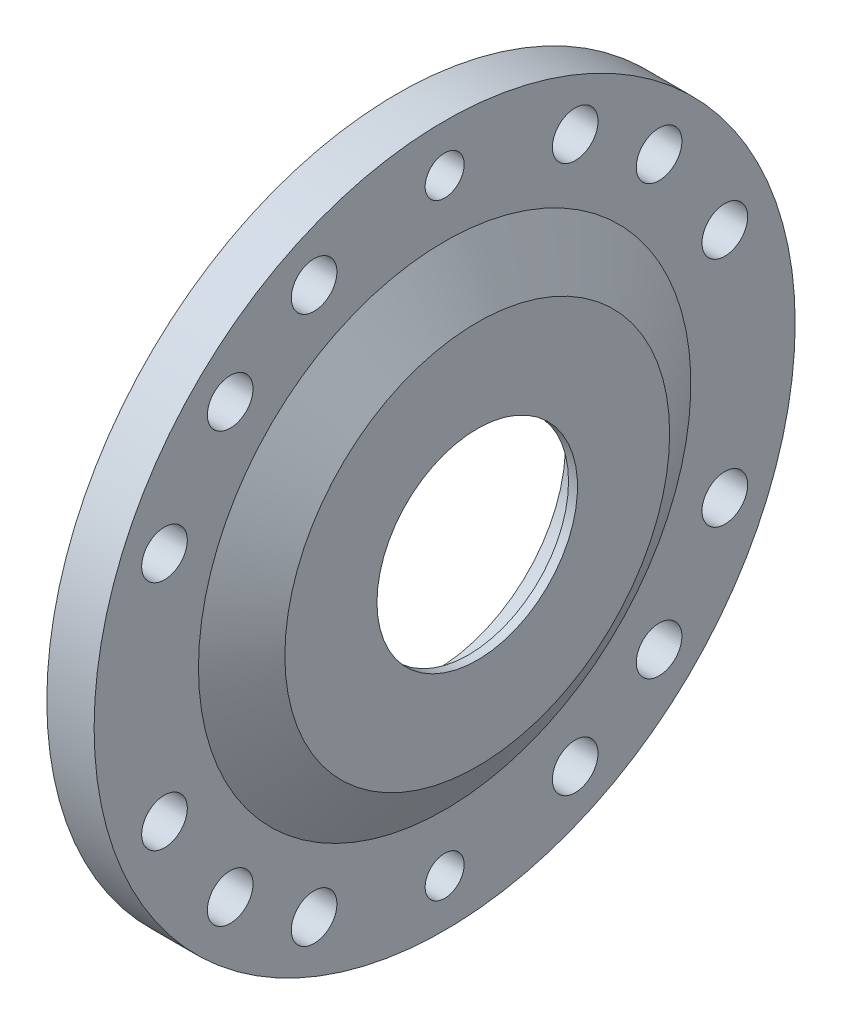
ISO-10303-21;
HEADER;
FILE_DESCRIPTION(('STEP AP214'),'2;1');
FILE_NAME('part.step','',(''),(''),'','','');
FILE_SCHEMA(('AUTOMOTIVE_DESIGN { 1 0 10303 214 1 1 1 1 }'));
ENDSEC;
DATA;
#1=APPLICATION_CONTEXT('core data for automotive mechanical design processes');
#2=APPLICATION_PROTOCOL_DEFINITION('international standard','automotive_design',2000,#1);
#3=PRODUCT_CONTEXT('',#1,'mechanical');
#4=PRODUCT('Part','Part','',(#3));
#5=PRODUCT_RELATED_PRODUCT_CATEGORY('part','',(#4));
#6=PRODUCT_DEFINITION_FORMATION('','',#4);
#7=PRODUCT_DEFINITION_CONTEXT('part definition',#1,'design');
#8=PRODUCT_DEFINITION('design','',#6,#7);
#9=PRODUCT_DEFINITION_SHAPE('','',#8);
#10=(LENGTH_UNIT() NAMED_UNIT(*) SI_UNIT(.MILLI.,.METRE.));
#11=(NAMED_UNIT(*) PLANE_ANGLE_UNIT() SI_UNIT($,.RADIAN.));
#12=(NAMED_UNIT(*) SI_UNIT($,.STERADIAN.) SOLID_ANGLE_UNIT());
#13=UNCERTAINTY_MEASURE_WITH_UNIT(LENGTH_MEASURE(1.E-05),#10,'distance_accuracy_value','');
#14=(GEOMETRIC_REPRESENTATION_CONTEXT(3) GLOBAL_UNCERTAINTY_ASSIGNED_CONTEXT((#13)) GLOBAL_UNIT_ASSIGNED_CONTEXT((#10,
#11,#12)) REPRESENTATION_CONTEXT('',''));
#15=CARTESIAN_POINT('',(0.,0.,0.));
#16=DIRECTION('',(0.,0.,1.));
#17=DIRECTION('',(1.,0.,0.));
#18=AXIS2_PLACEMENT_3D('',#15,#16,#17);
#19=CARTESIAN_POINT('',(78.2927896249337,0.,0.));
#20=DIRECTION('',(-1.,0.,0.));
#21=DIRECTION('',(0.,0.,1.));
#22=AXIS2_PLACEMENT_3D('',#19,#20,#21);
#23=PLANE('',#22);
#24=CARTESIAN_POINT('',(78.2927896249337,83.940431444537,-40.0375320031715));
#25=DIRECTION('',(-1.,0.,0.));
#26=DIRECTION('',(0.,0.,1.));
#27=AXIS2_PLACEMENT_3D('',#24,#25,#26);
#28=CIRCLE('',#27,7.);
#29=CARTESIAN_POINT('',(78.2927896249337,83.940431444537,-33.0375320031715));
#30=VERTEX_POINT('',#29);
#31=EDGE_CURVE('E103',#30,#30,#28,.T.);
#32=ORIENTED_EDGE('',*,*,#31,.T.);
#33=EDGE_LOOP('',(#32));
#34=FACE_BOUND('',#33,.T.);
#35=CARTESIAN_POINT('',(78.2927896249337,93.,0.));
#36=DIRECTION('',(-1.,0.,0.));
#37=DIRECTION('',(0.,0.,1.));
#38=AXIS2_PLACEMENT_3D('',#35,#36,#37);
#39=CIRCLE('',#38,5.983);
#40=CARTESIAN_POINT('',(78.2927896249337,93.,5.983));
#41=VERTEX_POINT('',#40);
#42=EDGE_CURVE('E107',#41,#41,#39,.T.);
#43=ORIENTED_EDGE('',*,*,#42,.T.);
#44=EDGE_LOOP('',(#43));
#45=FACE_BOUND('',#44,.T.);
#46=CARTESIAN_POINT('',(78.2927896249337,-35.5895592099531,85.9207965235497));
#47=DIRECTION('',(-1.,0.,0.));
#48=DIRECTION('',(0.,0.,1.));
#49=AXIS2_PLACEMENT_3D('',#46,#47,#48);
#50=CIRCLE('',#49,7.);
#51=CARTESIAN_POINT('',(78.2927896249337,-35.5895592099531,92.9207965235497));
#52=VERTEX_POINT('',#51);
#53=EDGE_CURVE('E123',#52,#52,#50,.T.);
#54=ORIENTED_EDGE('',*,*,#53,.T.);
#55=EDGE_LOOP('',(#54));
#56=FACE_BOUND('',#55,.T.);
#57=CARTESIAN_POINT('',(78.2927896249337,-65.7609306503488,65.760930650349));
#58=DIRECTION('',(-1.,0.,0.));
#59=DIRECTION('',(0.,0.,1.));
#60=AXIS2_PLACEMENT_3D('',#57,#58,#59);
#61=CIRCLE('',#60,7.00000000000004);
#62=CARTESIAN_POINT('',(78.2927896249337,-65.7609306503488,72.760930650349));
#63=VERTEX_POINT('',#62);
#64=EDGE_CURVE('E127',#63,#63,#61,.T.);
#65=ORIENTED_EDGE('',*,*,#64,.T.);
#66=EDGE_LOOP('',(#65));
#67=FACE_BOUND('',#66,.T.);
#68=CARTESIAN_POINT('',(78.2927896249337,-83.940431444537,40.0375320031714));
#69=DIRECTION('',(-1.,0.,0.));
#70=DIRECTION('',(0.,0.,1.));
#71=AXIS2_PLACEMENT_3D('',#68,#69,#70);
#72=CIRCLE('',#71,7.);
#73=CARTESIAN_POINT('',(78.2927896249337,-83.940431444537,47.0375320031714));
#74=VERTEX_POINT('',#73);
#75=EDGE_CURVE('E131',#74,#74,#72,.T.);
#76=ORIENTED_EDGE('',*,*,#75,.T.);
#77=EDGE_LOOP('',(#76));
#78=FACE_BOUND('',#77,.T.);
#79=CARTESIAN_POINT('',(78.2927896249337,35.589559209953,-85.9207965235498));
#80=DIRECTION('',(-1.,0.,0.));
#81=DIRECTION('',(0.,0.,1.));
#82=AXIS2_PLACEMENT_3D('',#79,#80,#81);
#83=CIRCLE('',#82,7.);
#84=CARTESIAN_POINT('',(78.2927896249337,35.589559209953,-78.9207965235498));
#85=VERTEX_POINT('',#84);
#86=EDGE_CURVE('E151',#85,#85,#83,.T.);
#87=ORIENTED_EDGE('',*,*,#86,.T.);
#88=EDGE_LOOP('',(#87));
#89=FACE_BOUND('',#88,.T.);
#90=CARTESIAN_POINT('',(78.2927896249337,65.7609306503488,-65.7609306503491));
#91=DIRECTION('',(-1.,0.,0.));
#92=DIRECTION('',(0.,0.,1.));
#93=AXIS2_PLACEMENT_3D('',#90,#91,#92);
#94=CIRCLE('',#93,7.);
#95=CARTESIAN_POINT('',(78.2927896249337,65.7609306503488,-58.760930650349));
#96=VERTEX_POINT('',#95);
#97=EDGE_CURVE('E155',#96,#96,#94,.T.);
#98=ORIENTED_EDGE('',*,*,#97,.T.);
#99=EDGE_LOOP('',(#98));
#100=FACE_BOUND('',#99,.T.);
#101=CARTESIAN_POINT('',(78.2927896249337,0.,0.));
#102=DIRECTION('',(-1.,0.,0.));
#103=DIRECTION('',(0.,0.,1.));
#104=AXIS2_PLACEMENT_3D('',#101,#102,#103);
#105=CIRCLE('',#104,107.5);
#106=CARTESIAN_POINT('',(78.2927896249337,0.,107.5));
#107=VERTEX_POINT('',#106);
#108=EDGE_CURVE('E79',#107,#107,#105,.T.);
#109=ORIENTED_EDGE('',*,*,#108,.F.);
#110=EDGE_LOOP('',(#109));
#111=FACE_BOUND('',#110,.T.);
#112=CARTESIAN_POINT('',(78.2927896249337,0.,0.));
#113=DIRECTION('',(-1.,0.,0.));
#114=DIRECTION('',(0.,0.,1.));
#115=AXIS2_PLACEMENT_3D('',#112,#113,#114);
#116=CIRCLE('',#115,75.5);
#117=CARTESIAN_POINT('',(78.2927896249337,0.,75.5));
#118=VERTEX_POINT('',#117);
#119=EDGE_CURVE('E75',#118,#118,#116,.T.);
#120=ORIENTED_EDGE('',*,*,#119,.T.);
#121=EDGE_LOOP('',(#120));
#122=FACE_BOUND('',#121,.T.);
#123=CARTESIAN_POINT('',(78.2927896249337,-35.589559209953,-85.9207965235498));
#124=DIRECTION('',(-1.,0.,0.));
#125=DIRECTION('',(0.,0.,1.));
#126=AXIS2_PLACEMENT_3D('',#123,#124,#125);
#127=CIRCLE('',#126,7.);
#128=CARTESIAN_POINT('',(78.2927896249337,-35.589559209953,-78.9207965235498));
#129=VERTEX_POINT('',#128);
#130=EDGE_CURVE('E147',#129,#129,#127,.F.);
#131=ORIENTED_EDGE('',*,*,#130,.F.);
#132=EDGE_LOOP('',(#131));
#133=FACE_BOUND('',#132,.T.);
#134=CARTESIAN_POINT('',(78.2927896249337,-65.7609306503488,-65.7609306503491));
#135=DIRECTION('',(-1.,0.,0.));
#136=DIRECTION('',(0.,0.,1.));
#137=AXIS2_PLACEMENT_3D('',#134,#135,#136);
#138=CIRCLE('',#137,7.00000000000002);
#139=CARTESIAN_POINT('',(78.2927896249337,-65.7609306503488,-58.7609306503491));
#140=VERTEX_POINT('',#139);
#141=EDGE_CURVE('E143',#140,#140,#138,.F.);
#142=ORIENTED_EDGE('',*,*,#141,.F.);
#143=EDGE_LOOP('',(#142));
#144=FACE_BOUND('',#143,.T.);
#145=CARTESIAN_POINT('',(78.2927896249337,-83.940431444537,-40.0375320031716));
#146=DIRECTION('',(-1.,0.,0.));
#147=DIRECTION('',(0.,0.,1.));
#148=AXIS2_PLACEMENT_3D('',#145,#146,#147);
#149=CIRCLE('',#148,7.);
#150=CARTESIAN_POINT('',(78.2927896249337,-83.940431444537,-33.0375320031716));
#151=VERTEX_POINT('',#150);
#152=EDGE_CURVE('E139',#151,#151,#149,.F.);
#153=ORIENTED_EDGE('',*,*,#152,.F.);
#154=EDGE_LOOP('',(#153));
#155=FACE_BOUND('',#154,.T.);
#156=CARTESIAN_POINT('',(78.2927896249337,-93.,0.));
#157=DIRECTION('',(-1.,0.,0.));
#158=DIRECTION('',(0.,0.,1.));
#159=AXIS2_PLACEMENT_3D('',#156,#157,#158);
#160=CIRCLE('',#159,5.98299999999995);
#161=CARTESIAN_POINT('',(78.2927896249337,-93.,5.98299999999995));
#162=VERTEX_POINT('',#161);
#163=EDGE_CURVE('E135',#162,#162,#160,.F.);
#164=ORIENTED_EDGE('',*,*,#163,.F.);
#165=EDGE_LOOP('',(#164));
#166=FACE_BOUND('',#165,.T.);
#167=CARTESIAN_POINT('',(78.2927896249337,35.5895592099531,85.9207965235498));
#168=DIRECTION('',(-1.,0.,0.));
#169=DIRECTION('',(0.,0.,1.));
#170=AXIS2_PLACEMENT_3D('',#167,#168,#169);
#171=CIRCLE('',#170,7.);
#172=CARTESIAN_POINT('',(78.2927896249337,35.5895592099531,92.9207965235498));
#173=VERTEX_POINT('',#172);
#174=EDGE_CURVE('E119',#173,#173,#171,.F.);
#175=ORIENTED_EDGE('',*,*,#174,.F.);
#176=EDGE_LOOP('',(#175));
#177=FACE_BOUND('',#176,.T.);
#178=CARTESIAN_POINT('',(78.2927896249337,65.7609306503488,65.7609306503491));
#179=DIRECTION('',(-1.,0.,0.));
#180=DIRECTION('',(0.,0.,1.));
#181=AXIS2_PLACEMENT_3D('',#178,#179,#180);
#182=CIRCLE('',#181,7.00000000000004);
#183=CARTESIAN_POINT('',(78.2927896249337,65.7609306503488,72.7609306503491));
#184=VERTEX_POINT('',#183);
#185=EDGE_CURVE('E115',#184,#184,#182,.F.);
#186=ORIENTED_EDGE('',*,*,#185,.F.);
#187=EDGE_LOOP('',(#186));
#188=FACE_BOUND('',#187,.T.);
#189=CARTESIAN_POINT('',(78.2927896249337,83.940431444537,40.0375320031715));
#190=DIRECTION('',(-1.,0.,0.));
#191=DIRECTION('',(0.,0.,1.));
#192=AXIS2_PLACEMENT_3D('',#189,#190,#191);
#193=CIRCLE('',#192,7.);
#194=CARTESIAN_POINT('',(78.2927896249337,83.940431444537,47.0375320031715));
#195=VERTEX_POINT('',#194);
#196=EDGE_CURVE('E111',#195,#195,#193,.F.);
#197=ORIENTED_EDGE('',*,*,#196,.F.);
#198=EDGE_LOOP('',(#197));
#199=FACE_BOUND('',#198,.T.);
#200=ADVANCED_FACE('F43',(#34,#45,#56,#67,#78,#89,#100,#111,#122,#133,#144,#155,#166,#177,#188,
#199),#23,.F.);
#201=CARTESIAN_POINT('',(63.7927896249337,0.,0.));
#202=DIRECTION('',(1.,0.,0.));
#203=DIRECTION('',(0.,0.,-1.));
#204=AXIS2_PLACEMENT_3D('',#201,#202,#203);
#205=PLANE('',#204);
#206=CARTESIAN_POINT('',(63.7927896249337,83.940431444537,-40.0375320031715));
#207=DIRECTION('',(-1.,0.,0.));
#208=DIRECTION('',(0.,0.,1.));
#209=AXIS2_PLACEMENT_3D('',#206,#207,#208);
#210=CIRCLE('',#209,7.);
#211=CARTESIAN_POINT('',(63.7927896249337,83.940431444537,-33.0375320031715));
#212=VERTEX_POINT('',#211);
#213=EDGE_CURVE('E163',#212,#212,#210,.T.);
#214=ORIENTED_EDGE('',*,*,#213,.F.);
#215=EDGE_LOOP('',(#214));
#216=FACE_BOUND('',#215,.T.);
#217=CARTESIAN_POINT('',(63.7927896249337,93.,0.));
#218=DIRECTION('',(-1.,0.,0.));
#219=DIRECTION('',(0.,0.,1.));
#220=AXIS2_PLACEMENT_3D('',#217,#218,#219);
#221=CIRCLE('',#220,5.983);
#222=CARTESIAN_POINT('',(63.7927896249337,93.,5.983));
#223=VERTEX_POINT('',#222);
#224=EDGE_CURVE('E189',#223,#223,#221,.T.);
#225=ORIENTED_EDGE('',*,*,#224,.F.);
#226=EDGE_LOOP('',(#225));
#227=FACE_BOUND('',#226,.T.);
#228=CARTESIAN_POINT('',(63.7927896249337,-35.5895592099531,85.9207965235497));
#229=DIRECTION('',(-1.,0.,0.));
#230=DIRECTION('',(0.,0.,1.));
#231=AXIS2_PLACEMENT_3D('',#228,#229,#230);
#232=CIRCLE('',#231,7.);
#233=CARTESIAN_POINT('',(63.7927896249337,-35.5895592099531,92.9207965235497));
#234=VERTEX_POINT('',#233);
#235=EDGE_CURVE('E173',#234,#234,#232,.T.);
#236=ORIENTED_EDGE('',*,*,#235,.F.);
#237=EDGE_LOOP('',(#236));
#238=FACE_BOUND('',#237,.T.);
#239=CARTESIAN_POINT('',(63.7927896249337,-65.7609306503488,65.760930650349));
#240=DIRECTION('',(-1.,0.,0.));
#241=DIRECTION('',(0.,0.,1.));
#242=AXIS2_PLACEMENT_3D('',#239,#240,#241);
#243=CIRCLE('',#242,7.00000000000004);
#244=CARTESIAN_POINT('',(63.7927896249337,-65.7609306503488,72.760930650349));
#245=VERTEX_POINT('',#244);
#246=EDGE_CURVE('E168',#245,#245,#243,.T.);
#247=ORIENTED_EDGE('',*,*,#246,.F.);
#248=EDGE_LOOP('',(#247));
#249=FACE_BOUND('',#248,.T.);
#250=CARTESIAN_POINT('',(63.7927896249337,-83.940431444537,40.0375320031714));
#251=DIRECTION('',(-1.,0.,0.));
#252=DIRECTION('',(0.,0.,1.));
#253=AXIS2_PLACEMENT_3D('',#250,#251,#252);
#254=CIRCLE('',#253,7.);
#255=CARTESIAN_POINT('',(63.7927896249337,-83.940431444537,47.0375320031714));
#256=VERTEX_POINT('',#255);
#257=EDGE_CURVE('E164',#256,#256,#254,.T.);
#258=ORIENTED_EDGE('',*,*,#257,.F.);
#259=EDGE_LOOP('',(#258));
#260=FACE_BOUND('',#259,.T.);
#261=CARTESIAN_POINT('',(63.7927896249337,35.589559209953,-85.9207965235498));
#262=DIRECTION('',(-1.,0.,0.));
#263=DIRECTION('',(0.,0.,1.));
#264=AXIS2_PLACEMENT_3D('',#261,#262,#263);
#265=CIRCLE('',#264,7.);
#266=CARTESIAN_POINT('',(63.7927896249337,35.589559209953,-78.9207965235498));
#267=VERTEX_POINT('',#266);
#268=EDGE_CURVE('E196',#267,#267,#265,.T.);
#269=ORIENTED_EDGE('',*,*,#268,.F.);
#270=EDGE_LOOP('',(#269));
#271=FACE_BOUND('',#270,.T.);
#272=CARTESIAN_POINT('',(63.7927896249337,65.7609306503488,-65.7609306503491));
#273=DIRECTION('',(-1.,0.,0.));
#274=DIRECTION('',(0.,0.,1.));
#275=AXIS2_PLACEMENT_3D('',#272,#273,#274);
#276=CIRCLE('',#275,7.);
#277=CARTESIAN_POINT('',(63.7927896249337,65.7609306503488,-58.760930650349));
#278=VERTEX_POINT('',#277);
#279=EDGE_CURVE('E159',#278,#278,#276,.T.);
#280=ORIENTED_EDGE('',*,*,#279,.F.);
#281=EDGE_LOOP('',(#280));
#282=FACE_BOUND('',#281,.T.);
#283=CARTESIAN_POINT('',(63.7927896249337,0.,0.));
#284=DIRECTION('',(-1.,0.,0.));
#285=DIRECTION('',(0.,0.,1.));
#286=AXIS2_PLACEMENT_3D('',#283,#284,#285);
#287=CIRCLE('',#286,70.);
#288=CARTESIAN_POINT('',(63.7927896249337,0.,70.));
#289=VERTEX_POINT('',#288);
#290=EDGE_CURVE('E87',#289,#289,#287,.T.);
#291=ORIENTED_EDGE('',*,*,#290,.F.);
#292=EDGE_LOOP('',(#291));
#293=FACE_BOUND('',#292,.T.);
#294=CARTESIAN_POINT('',(63.7927896249337,0.,0.));
#295=DIRECTION('',(-1.,0.,0.));
#296=DIRECTION('',(0.,0.,1.));
#297=AXIS2_PLACEMENT_3D('',#294,#295,#296);
#298=CIRCLE('',#297,107.5);
#299=CARTESIAN_POINT('',(63.7927896249337,0.,107.5));
#300=VERTEX_POINT('',#299);
#301=EDGE_CURVE('E83',#300,#300,#298,.T.);
#302=ORIENTED_EDGE('',*,*,#301,.T.);
#303=EDGE_LOOP('',(#302));
#304=FACE_BOUND('',#303,.T.);
#305=CARTESIAN_POINT('',(63.7927896249337,-35.589559209953,-85.9207965235498));
#306=DIRECTION('',(1.,0.,0.));
#307=DIRECTION('',(0.,0.,-1.));
#308=AXIS2_PLACEMENT_3D('',#305,#306,#307);
#309=CIRCLE('',#308,7.);
#310=CARTESIAN_POINT('',(63.7927896249337,-35.589559209953,-92.9207965235498));
#311=VERTEX_POINT('',#310);
#312=EDGE_CURVE('E200',#311,#311,#309,.T.);
#313=ORIENTED_EDGE('',*,*,#312,.T.);
#314=EDGE_LOOP('',(#313));
#315=FACE_BOUND('',#314,.T.);
#316=CARTESIAN_POINT('',(63.7927896249337,-65.7609306503488,-65.7609306503491));
#317=DIRECTION('',(1.,0.,0.));
#318=DIRECTION('',(0.,0.,-1.));
#319=AXIS2_PLACEMENT_3D('',#316,#317,#318);
#320=CIRCLE('',#319,7.00000000000002);
#321=CARTESIAN_POINT('',(63.7927896249337,-65.7609306503488,-72.7609306503491));
#322=VERTEX_POINT('',#321);
#323=EDGE_CURVE('E205',#322,#322,#320,.T.);
#324=ORIENTED_EDGE('',*,*,#323,.T.);
#325=EDGE_LOOP('',(#324));
#326=FACE_BOUND('',#325,.T.);
#327=CARTESIAN_POINT('',(63.7927896249337,-83.940431444537,-40.0375320031716));
#328=DIRECTION('',(1.,0.,0.));
#329=DIRECTION('',(0.,0.,-1.));
#330=AXIS2_PLACEMENT_3D('',#327,#328,#329);
#331=CIRCLE('',#330,7.);
#332=CARTESIAN_POINT('',(63.7927896249337,-83.940431444537,-47.0375320031716));
#333=VERTEX_POINT('',#332);
#334=EDGE_CURVE('E209',#333,#333,#331,.T.);
#335=ORIENTED_EDGE('',*,*,#334,.T.);
#336=EDGE_LOOP('',(#335));
#337=FACE_BOUND('',#336,.T.);
#338=CARTESIAN_POINT('',(63.7927896249337,-93.,0.));
#339=DIRECTION('',(1.,0.,0.));
#340=DIRECTION('',(0.,0.,-1.));
#341=AXIS2_PLACEMENT_3D('',#338,#339,#340);
#342=CIRCLE('',#341,5.98299999999995);
#343=CARTESIAN_POINT('',(63.7927896249337,-93.,-5.98299999999995));
#344=VERTEX_POINT('',#343);
#345=EDGE_CURVE('E169',#344,#344,#342,.T.);
#346=ORIENTED_EDGE('',*,*,#345,.T.);
#347=EDGE_LOOP('',(#346));
#348=FACE_BOUND('',#347,.T.);
#349=CARTESIAN_POINT('',(63.7927896249337,35.5895592099531,85.9207965235498));
#350=DIRECTION('',(1.,0.,0.));
#351=DIRECTION('',(0.,0.,-1.));
#352=AXIS2_PLACEMENT_3D('',#349,#350,#351);
#353=CIRCLE('',#352,7.);
#354=CARTESIAN_POINT('',(63.7927896249337,35.5895592099531,78.9207965235498));
#355=VERTEX_POINT('',#354);
#356=EDGE_CURVE('E177',#355,#355,#353,.T.);
#357=ORIENTED_EDGE('',*,*,#356,.T.);
#358=EDGE_LOOP('',(#357));
#359=FACE_BOUND('',#358,.T.);
#360=CARTESIAN_POINT('',(63.7927896249337,65.7609306503488,65.7609306503491));
#361=DIRECTION('',(1.,0.,0.));
#362=DIRECTION('',(0.,0.,-1.));
#363=AXIS2_PLACEMENT_3D('',#360,#361,#362);
#364=CIRCLE('',#363,7.00000000000004);
#365=CARTESIAN_POINT('',(63.7927896249337,65.7609306503488,58.760930650349));
#366=VERTEX_POINT('',#365);
#367=EDGE_CURVE('E181',#366,#366,#364,.T.);
#368=ORIENTED_EDGE('',*,*,#367,.T.);
#369=EDGE_LOOP('',(#368));
#370=FACE_BOUND('',#369,.T.);
#371=CARTESIAN_POINT('',(63.7927896249337,83.940431444537,40.0375320031715));
#372=DIRECTION('',(1.,0.,0.));
#373=DIRECTION('',(0.,0.,-1.));
#374=AXIS2_PLACEMENT_3D('',#371,#372,#373);
#375=CIRCLE('',#374,7.);
#376=CARTESIAN_POINT('',(63.7927896249337,83.940431444537,33.0375320031715));
#377=VERTEX_POINT('',#376);
#378=EDGE_CURVE('E185',#377,#377,#375,.T.);
#379=ORIENTED_EDGE('',*,*,#378,.T.);
#380=EDGE_LOOP('',(#379));
#381=FACE_BOUND('',#380,.T.);
#382=ADVANCED_FACE('F244',(#216,#227,#238,#249,#260,#271,#282,#293,#304,#315,#326,#337,#348,
#359,#370,#381),#205,.F.);
#383=CARTESIAN_POINT('',(85.5363851305517,0.,0.));
#384=DIRECTION('',(-1.,0.,0.));
#385=DIRECTION('',(0.,0.,1.));
#386=AXIS2_PLACEMENT_3D('',#383,#384,#385);
#387=CYLINDRICAL_SURFACE('',#386,40.);
#388=CARTESIAN_POINT('',(85.5363851305517,0.,0.));
#389=DIRECTION('',(-1.,0.,0.));
#390=DIRECTION('',(0.,0.,1.));
#391=AXIS2_PLACEMENT_3D('',#388,#389,#390);
#392=CIRCLE('',#391,40.);
#393=CARTESIAN_POINT('',(85.5363851305517,0.,40.));
#394=VERTEX_POINT('',#393);
#395=EDGE_CURVE('E67',#394,#394,#392,.T.);
#396=ORIENTED_EDGE('',*,*,#395,.F.);
#397=EDGE_LOOP('',(#396));
#398=FACE_BOUND('',#397,.T.);
#399=CARTESIAN_POINT('',(75.3478458047089,0.,0.));
#400=DIRECTION('',(-1.,0.,0.));
#401=DIRECTION('',(0.,0.,1.));
#402=AXIS2_PLACEMENT_3D('',#399,#400,#401);
#403=CIRCLE('',#402,40.);
#404=CARTESIAN_POINT('',(75.3478458047089,0.,40.));
#405=VERTEX_POINT('',#404);
#406=EDGE_CURVE('E99',#405,#405,#403,.T.);
#407=ORIENTED_EDGE('',*,*,#406,.T.);
#408=EDGE_LOOP('',(#407));
#409=FACE_BOUND('',#408,.T.);
#410=ADVANCED_FACE('F238',(#398,#409),#387,.F.);
#411=CARTESIAN_POINT('',(85.5363851305517,0.,0.));
#412=DIRECTION('',(1.,0.,0.));
#413=DIRECTION('',(0.,0.,-1.));
#414=AXIS2_PLACEMENT_3D('',#411,#412,#413);
#415=PLANE('',#414);
#416=CARTESIAN_POINT('',(85.5363851305517,0.,0.));
#417=DIRECTION('',(1.,0.,0.));
#418=DIRECTION('',(0.,0.,-1.));
#419=AXIS2_PLACEMENT_3D('',#416,#417,#418);
#420=CIRCLE('',#419,30.75);
#421=CARTESIAN_POINT('',(85.5363851305517,0.,-30.75));
#422=VERTEX_POINT('',#421);
#423=EDGE_CURVE('E201',#422,#422,#420,.T.);
#424=ORIENTED_EDGE('',*,*,#423,.T.);
#425=EDGE_LOOP('',(#424));
#426=FACE_BOUND('',#425,.T.);
#427=ORIENTED_EDGE('',*,*,#395,.T.);
#428=EDGE_LOOP('',(#427));
#429=FACE_BOUND('',#428,.T.);
#430=ADVANCED_FACE('F235',(#426,#429),#415,.F.);
#431=CARTESIAN_POINT('',(88.2927896249337,0.,0.));
#432=DIRECTION('',(-1.,0.,0.));
#433=DIRECTION('',(0.,0.,1.));
#434=AXIS2_PLACEMENT_3D('',#431,#432,#433);
#435=PLANE('',#434);
#436=CARTESIAN_POINT('',(88.2927896249337,0.,0.));
#437=DIRECTION('',(-1.,0.,0.));
#438=DIRECTION('',(0.,0.,1.));
#439=AXIS2_PLACEMENT_3D('',#436,#437,#438);
#440=CIRCLE('',#439,30.75);
#441=CARTESIAN_POINT('',(88.2927896249337,0.,30.75));
#442=VERTEX_POINT('',#441);
#443=EDGE_CURVE('E219',#442,#442,#440,.T.);
#444=ORIENTED_EDGE('',*,*,#443,.T.);
#445=EDGE_LOOP('',(#444));
#446=FACE_BOUND('',#445,.T.);
#447=CARTESIAN_POINT('',(88.2927896249337,0.,0.));
#448=DIRECTION('',(-1.,0.,0.));
#449=DIRECTION('',(0.,0.,1.));
#450=AXIS2_PLACEMENT_3D('',#447,#448,#449);
#451=CIRCLE('',#450,59.);
#452=CARTESIAN_POINT('',(88.2927896249337,0.,59.));
#453=VERTEX_POINT('',#452);
#454=EDGE_CURVE('E71',#453,#453,#451,.T.);
#455=ORIENTED_EDGE('',*,*,#454,.F.);
#456=EDGE_LOOP('',(#455));
#457=FACE_BOUND('',#456,.T.);
#458=ADVANCED_FACE('F224',(#446,#457),#435,.F.);
#459=CARTESIAN_POINT('',(88.2927896249337,0.,0.));
#460=DIRECTION('',(-1.,0.,0.));
#461=DIRECTION('',(0.,0.,1.));
#462=AXIS2_PLACEMENT_3D('',#459,#460,#461);
#463=CONICAL_SURFACE('',#462,59.,1.02593241134335);
#464=ORIENTED_EDGE('',*,*,#119,.F.);
#465=EDGE_LOOP('',(#464));
#466=FACE_BOUND('',#465,.T.);
#467=ORIENTED_EDGE('',*,*,#454,.T.);
#468=EDGE_LOOP('',(#467));
#469=FACE_BOUND('',#468,.T.);
#470=ADVANCED_FACE('F274',(#466,#469),#463,.T.);
#471=CARTESIAN_POINT('',(85.5363851305517,0.,0.));
#472=DIRECTION('',(-1.,0.,0.));
#473=DIRECTION('',(0.,0.,1.));
#474=AXIS2_PLACEMENT_3D('',#471,#472,#473);
#475=CYLINDRICAL_SURFACE('',#474,107.5);
#476=ORIENTED_EDGE('',*,*,#301,.F.);
#477=EDGE_LOOP('',(#476));
#478=FACE_BOUND('',#477,.T.);
#479=ORIENTED_EDGE('',*,*,#108,.T.);
#480=EDGE_LOOP('',(#479));
#481=FACE_BOUND('',#480,.T.);
#482=ADVANCED_FACE('F273',(#478,#481),#475,.T.);
#483=CARTESIAN_POINT('',(85.5363851305517,0.,0.));
#484=DIRECTION('',(-1.,0.,0.));
#485=DIRECTION('',(0.,0.,1.));
#486=AXIS2_PLACEMENT_3D('',#483,#484,#485);
#487=CYLINDRICAL_SURFACE('',#486,70.);
#488=CARTESIAN_POINT('',(61.7927896249337,0.,0.));
#489=DIRECTION('',(1.,0.,0.));
#490=DIRECTION('',(0.,0.,-1.));
#491=AXIS2_PLACEMENT_3D('',#488,#489,#490);
#492=CIRCLE('',#491,70.);
#493=CARTESIAN_POINT('',(61.7927896249337,0.,-70.));
#494=VERTEX_POINT('',#493);
#495=EDGE_CURVE('E56',#494,#494,#492,.T.);
#496=ORIENTED_EDGE('',*,*,#495,.T.);
#497=EDGE_LOOP('',(#496));
#498=FACE_BOUND('',#497,.T.);
#499=ORIENTED_EDGE('',*,*,#290,.T.);
#500=EDGE_LOOP('',(#499));
#501=FACE_BOUND('',#500,.T.);
#502=ADVANCED_FACE('F292',(#498,#501),#487,.T.);
#503=CARTESIAN_POINT('',(60.7927896249337,0.,0.));
#504=DIRECTION('',(1.,0.,0.));
#505=DIRECTION('',(0.,0.,-1.));
#506=AXIS2_PLACEMENT_3D('',#503,#504,#505);
#507=PLANE('',#506);
#508=CARTESIAN_POINT('',(60.7927896249337,0.,0.));
#509=DIRECTION('',(1.,0.,0.));
#510=DIRECTION('',(0.,0.,-1.));
#511=AXIS2_PLACEMENT_3D('',#508,#509,#510);
#512=CIRCLE('',#511,69.);
#513=CARTESIAN_POINT('',(60.7927896249337,0.,-69.));
#514=VERTEX_POINT('',#513);
#515=EDGE_CURVE('E61',#514,#514,#512,.F.);
#516=ORIENTED_EDGE('',*,*,#515,.T.);
#517=EDGE_LOOP('',(#516));
#518=FACE_BOUND('',#517,.T.);
#519=CARTESIAN_POINT('',(60.7927896249337,0.,0.));
#520=DIRECTION('',(-1.,0.,0.));
#521=DIRECTION('',(0.,0.,1.));
#522=AXIS2_PLACEMENT_3D('',#519,#520,#521);
#523=CIRCLE('',#522,61.);
#524=CARTESIAN_POINT('',(60.7927896249337,0.,61.));
#525=VERTEX_POINT('',#524);
#526=EDGE_CURVE('E91',#525,#525,#523,.T.);
#527=ORIENTED_EDGE('',*,*,#526,.F.);
#528=EDGE_LOOP('',(#527));
#529=FACE_BOUND('',#528,.T.);
#530=ADVANCED_FACE('F289',(#518,#529),#507,.F.);
#531=CARTESIAN_POINT('',(60.7927896249337,0.,0.));
#532=DIRECTION('',(-1.,0.,0.));
#533=DIRECTION('',(0.,0.,1.));
#534=AXIS2_PLACEMENT_3D('',#531,#532,#533);
#535=CONICAL_SURFACE('',#534,61.,1.02593241134334);
#536=CARTESIAN_POINT('',(61.3988502309943,0.,0.));
#537=DIRECTION('',(-1.,0.,0.));
#538=DIRECTION('',(0.,0.,1.));
#539=AXIS2_PLACEMENT_3D('',#536,#537,#538);
#540=CIRCLE('',#539,60.);
#541=CARTESIAN_POINT('',(61.3988502309943,0.,60.));
#542=VERTEX_POINT('',#541);
#543=EDGE_CURVE('E95',#542,#542,#540,.T.);
#544=ORIENTED_EDGE('',*,*,#543,.F.);
#545=EDGE_LOOP('',(#544));
#546=FACE_BOUND('',#545,.T.);
#547=ORIENTED_EDGE('',*,*,#526,.T.);
#548=EDGE_LOOP('',(#547));
#549=FACE_BOUND('',#548,.T.);
#550=ADVANCED_FACE('F260',(#546,#549),#535,.F.);
#551=CARTESIAN_POINT('',(85.5363851305517,0.,0.));
#552=DIRECTION('',(-1.,0.,0.));
#553=DIRECTION('',(0.,0.,1.));
#554=AXIS2_PLACEMENT_3D('',#551,#552,#553);
#555=CYLINDRICAL_SURFACE('',#554,60.);
#556=CARTESIAN_POINT('',(72.8478458047089,0.,0.));
#557=DIRECTION('',(1.,0.,0.));
#558=DIRECTION('',(0.,0.,-1.));
#559=AXIS2_PLACEMENT_3D('',#556,#557,#558);
#560=CIRCLE('',#559,60.);
#561=CARTESIAN_POINT('',(72.8478458047089,0.,-60.));
#562=VERTEX_POINT('',#561);
#563=EDGE_CURVE('E10',#562,#562,#560,.T.);
#564=ORIENTED_EDGE('',*,*,#563,.T.);
#565=EDGE_LOOP('',(#564));
#566=FACE_BOUND('',#565,.T.);
#567=ORIENTED_EDGE('',*,*,#543,.T.);
#568=EDGE_LOOP('',(#567));
#569=FACE_BOUND('',#568,.T.);
#570=ADVANCED_FACE('F251',(#566,#569),#555,.F.);
#571=CARTESIAN_POINT('',(75.3478458047089,0.,0.));
#572=DIRECTION('',(1.,0.,0.));
#573=DIRECTION('',(0.,0.,-1.));
#574=AXIS2_PLACEMENT_3D('',#571,#572,#573);
#575=PLANE('',#574);
#576=CARTESIAN_POINT('',(75.3478458047089,0.,0.));
#577=DIRECTION('',(1.,0.,0.));
#578=DIRECTION('',(0.,0.,-1.));
#579=AXIS2_PLACEMENT_3D('',#576,#577,#578);
#580=CIRCLE('',#579,57.5);
#581=CARTESIAN_POINT('',(75.3478458047089,0.,-57.5));
#582=VERTEX_POINT('',#581);
#583=EDGE_CURVE('E51',#582,#582,#580,.F.);
#584=ORIENTED_EDGE('',*,*,#583,.T.);
#585=EDGE_LOOP('',(#584));
#586=FACE_BOUND('',#585,.T.);
#587=ORIENTED_EDGE('',*,*,#406,.F.);
#588=EDGE_LOOP('',(#587));
#589=FACE_BOUND('',#588,.T.);
#590=ADVANCED_FACE('F248',(#586,#589),#575,.F.);
#591=CARTESIAN_POINT('',(88.2927896249337,65.7609306503488,-65.7609306503491));
#592=DIRECTION('',(-1.,0.,0.));
#593=DIRECTION('',(0.,0.,1.));
#594=AXIS2_PLACEMENT_3D('',#591,#592,#593);
#595=CYLINDRICAL_SURFACE('',#594,7.);
#596=ORIENTED_EDGE('',*,*,#279,.T.);
#597=EDGE_LOOP('',(#596));
#598=FACE_BOUND('',#597,.T.);
#599=ORIENTED_EDGE('',*,*,#97,.F.);
#600=EDGE_LOOP('',(#599));
#601=FACE_BOUND('',#600,.T.);
#602=ADVANCED_FACE('F250',(#598,#601),#595,.F.);
#603=CARTESIAN_POINT('',(88.2927896249337,35.589559209953,-85.9207965235498));
#604=DIRECTION('',(-1.,0.,0.));
#605=DIRECTION('',(0.,0.,1.));
#606=AXIS2_PLACEMENT_3D('',#603,#604,#605);
#607=CYLINDRICAL_SURFACE('',#606,7.);
#608=ORIENTED_EDGE('',*,*,#268,.T.);
#609=EDGE_LOOP('',(#608));
#610=FACE_BOUND('',#609,.T.);
#611=ORIENTED_EDGE('',*,*,#86,.F.);
#612=EDGE_LOOP('',(#611));
#613=FACE_BOUND('',#612,.T.);
#614=ADVANCED_FACE('F257',(#610,#613),#607,.F.);
#615=CARTESIAN_POINT('',(88.2927896249337,-35.589559209953,-85.9207965235498));
#616=DIRECTION('',(-1.,0.,0.));
#617=DIRECTION('',(0.,0.,1.));
#618=AXIS2_PLACEMENT_3D('',#615,#616,#617);
#619=CYLINDRICAL_SURFACE('',#618,7.);
#620=ORIENTED_EDGE('',*,*,#312,.F.);
#621=EDGE_LOOP('',(#620));
#622=FACE_BOUND('',#621,.T.);
#623=ORIENTED_EDGE('',*,*,#130,.T.);
#624=EDGE_LOOP('',(#623));
#625=FACE_BOUND('',#624,.T.);
#626=ADVANCED_FACE('F404',(#622,#625),#619,.F.);
#627=CARTESIAN_POINT('',(88.2927896249337,-65.7609306503488,-65.7609306503491));
#628=DIRECTION('',(-1.,0.,0.));
#629=DIRECTION('',(0.,0.,1.));
#630=AXIS2_PLACEMENT_3D('',#627,#628,#629);
#631=CYLINDRICAL_SURFACE('',#630,7.00000000000002);
#632=ORIENTED_EDGE('',*,*,#323,.F.);
#633=EDGE_LOOP('',(#632));
#634=FACE_BOUND('',#633,.T.);
#635=ORIENTED_EDGE('',*,*,#141,.T.);
#636=EDGE_LOOP('',(#635));
#637=FACE_BOUND('',#636,.T.);
#638=ADVANCED_FACE('F398',(#634,#637),#631,.F.);
#639=CARTESIAN_POINT('',(88.2927896249337,-83.940431444537,-40.0375320031716));
#640=DIRECTION('',(-1.,0.,0.));
#641=DIRECTION('',(0.,0.,1.));
#642=AXIS2_PLACEMENT_3D('',#639,#640,#641);
#643=CYLINDRICAL_SURFACE('',#642,7.);
#644=ORIENTED_EDGE('',*,*,#334,.F.);
#645=EDGE_LOOP('',(#644));
#646=FACE_BOUND('',#645,.T.);
#647=ORIENTED_EDGE('',*,*,#152,.T.);
#648=EDGE_LOOP('',(#647));
#649=FACE_BOUND('',#648,.T.);
#650=ADVANCED_FACE('F366',(#646,#649),#643,.F.);
#651=CARTESIAN_POINT('',(88.2927896249337,-93.,0.));
#652=DIRECTION('',(-1.,0.,0.));
#653=DIRECTION('',(0.,0.,1.));
#654=AXIS2_PLACEMENT_3D('',#651,#652,#653);
#655=CYLINDRICAL_SURFACE('',#654,5.98299999999995);
#656=ORIENTED_EDGE('',*,*,#345,.F.);
#657=EDGE_LOOP('',(#656));
#658=FACE_BOUND('',#657,.T.);
#659=ORIENTED_EDGE('',*,*,#163,.T.);
#660=EDGE_LOOP('',(#659));
#661=FACE_BOUND('',#660,.T.);
#662=ADVANCED_FACE('F361',(#658,#661),#655,.F.);
#663=CARTESIAN_POINT('',(88.2927896249337,-83.940431444537,40.0375320031714));
#664=DIRECTION('',(-1.,0.,0.));
#665=DIRECTION('',(0.,0.,1.));
#666=AXIS2_PLACEMENT_3D('',#663,#664,#665);
#667=CYLINDRICAL_SURFACE('',#666,7.);
#668=ORIENTED_EDGE('',*,*,#257,.T.);
#669=EDGE_LOOP('',(#668));
#670=FACE_BOUND('',#669,.T.);
#671=ORIENTED_EDGE('',*,*,#75,.F.);
#672=EDGE_LOOP('',(#671));
#673=FACE_BOUND('',#672,.T.);
#674=ADVANCED_FACE('F358',(#670,#673),#667,.F.);
#675=CARTESIAN_POINT('',(88.2927896249337,-65.7609306503488,65.760930650349));
#676=DIRECTION('',(-1.,0.,0.));
#677=DIRECTION('',(0.,0.,1.));
#678=AXIS2_PLACEMENT_3D('',#675,#676,#677);
#679=CYLINDRICAL_SURFACE('',#678,7.00000000000004);
#680=ORIENTED_EDGE('',*,*,#246,.T.);
#681=EDGE_LOOP('',(#680));
#682=FACE_BOUND('',#681,.T.);
#683=ORIENTED_EDGE('',*,*,#64,.F.);
#684=EDGE_LOOP('',(#683));
#685=FACE_BOUND('',#684,.T.);
#686=ADVANCED_FACE('F354',(#682,#685),#679,.F.);
#687=CARTESIAN_POINT('',(88.2927896249337,-35.5895592099531,85.9207965235497));
#688=DIRECTION('',(-1.,0.,0.));
#689=DIRECTION('',(0.,0.,1.));
#690=AXIS2_PLACEMENT_3D('',#687,#688,#689);
#691=CYLINDRICAL_SURFACE('',#690,7.);
#692=ORIENTED_EDGE('',*,*,#235,.T.);
#693=EDGE_LOOP('',(#692));
#694=FACE_BOUND('',#693,.T.);
#695=ORIENTED_EDGE('',*,*,#53,.F.);
#696=EDGE_LOOP('',(#695));
#697=FACE_BOUND('',#696,.T.);
#698=ADVANCED_FACE('F350',(#694,#697),#691,.F.);
#699=CARTESIAN_POINT('',(88.2927896249337,35.5895592099531,85.9207965235498));
#700=DIRECTION('',(-1.,0.,0.));
#701=DIRECTION('',(0.,0.,1.));
#702=AXIS2_PLACEMENT_3D('',#699,#700,#701);
#703=CYLINDRICAL_SURFACE('',#702,7.);
#704=ORIENTED_EDGE('',*,*,#356,.F.);
#705=EDGE_LOOP('',(#704));
#706=FACE_BOUND('',#705,.T.);
#707=ORIENTED_EDGE('',*,*,#174,.T.);
#708=EDGE_LOOP('',(#707));
#709=FACE_BOUND('',#708,.T.);
#710=ADVANCED_FACE('F343',(#706,#709),#703,.F.);
#711=CARTESIAN_POINT('',(88.2927896249337,65.7609306503488,65.7609306503491));
#712=DIRECTION('',(-1.,0.,0.));
#713=DIRECTION('',(0.,0.,1.));
#714=AXIS2_PLACEMENT_3D('',#711,#712,#713);
#715=CYLINDRICAL_SURFACE('',#714,7.00000000000004);
#716=ORIENTED_EDGE('',*,*,#367,.F.);
#717=EDGE_LOOP('',(#716));
#718=FACE_BOUND('',#717,.T.);
#719=ORIENTED_EDGE('',*,*,#185,.T.);
#720=EDGE_LOOP('',(#719));
#721=FACE_BOUND('',#720,.T.);
#722=ADVANCED_FACE('F333',(#718,#721),#715,.F.);
#723=CARTESIAN_POINT('',(88.2927896249337,83.940431444537,40.0375320031715));
#724=DIRECTION('',(-1.,0.,0.));
#725=DIRECTION('',(0.,0.,1.));
#726=AXIS2_PLACEMENT_3D('',#723,#724,#725);
#727=CYLINDRICAL_SURFACE('',#726,7.);
#728=ORIENTED_EDGE('',*,*,#378,.F.);
#729=EDGE_LOOP('',(#728));
#730=FACE_BOUND('',#729,.T.);
#731=ORIENTED_EDGE('',*,*,#196,.T.);
#732=EDGE_LOOP('',(#731));
#733=FACE_BOUND('',#732,.T.);
#734=ADVANCED_FACE('F329',(#730,#733),#727,.F.);
#735=CARTESIAN_POINT('',(88.2927896249337,93.,0.));
#736=DIRECTION('',(-1.,0.,0.));
#737=DIRECTION('',(0.,0.,1.));
#738=AXIS2_PLACEMENT_3D('',#735,#736,#737);
#739=CYLINDRICAL_SURFACE('',#738,5.983);
#740=ORIENTED_EDGE('',*,*,#224,.T.);
#741=EDGE_LOOP('',(#740));
#742=FACE_BOUND('',#741,.T.);
#743=ORIENTED_EDGE('',*,*,#42,.F.);
#744=EDGE_LOOP('',(#743));
#745=FACE_BOUND('',#744,.T.);
#746=ADVANCED_FACE('F332',(#742,#745),#739,.F.);
#747=CARTESIAN_POINT('',(88.2927896249337,83.940431444537,-40.0375320031715));
#748=DIRECTION('',(-1.,0.,0.));
#749=DIRECTION('',(0.,0.,1.));
#750=AXIS2_PLACEMENT_3D('',#747,#748,#749);
#751=CYLINDRICAL_SURFACE('',#750,7.);
#752=ORIENTED_EDGE('',*,*,#213,.T.);
#753=EDGE_LOOP('',(#752));
#754=FACE_BOUND('',#753,.T.);
#755=ORIENTED_EDGE('',*,*,#31,.F.);
#756=EDGE_LOOP('',(#755));
#757=FACE_BOUND('',#756,.T.);
#758=ADVANCED_FACE('F231',(#754,#757),#751,.F.);
#759=CARTESIAN_POINT('',(88.2927896249337,0.,0.));
#760=DIRECTION('',(-1.,0.,0.));
#761=DIRECTION('',(0.,0.,1.));
#762=AXIS2_PLACEMENT_3D('',#759,#760,#761);
#763=CYLINDRICAL_SURFACE('',#762,30.75);
#764=ORIENTED_EDGE('',*,*,#443,.F.);
#765=EDGE_LOOP('',(#764));
#766=FACE_BOUND('',#765,.T.);
#767=ORIENTED_EDGE('',*,*,#423,.F.);
#768=EDGE_LOOP('',(#767));
#769=FACE_BOUND('',#768,.T.);
#770=ADVANCED_FACE('F227',(#766,#769),#763,.F.);
#771=CARTESIAN_POINT('',(61.7927896249337,0.,0.));
#772=DIRECTION('',(1.,0.,0.));
#773=DIRECTION('',(0.,0.,-1.));
#774=AXIS2_PLACEMENT_3D('',#771,#772,#773);
#775=TOROIDAL_SURFACE('',#774,69.,1.);
#776=ORIENTED_EDGE('',*,*,#495,.F.);
#777=EDGE_LOOP('',(#776));
#778=FACE_BOUND('',#777,.T.);
#779=ORIENTED_EDGE('',*,*,#515,.F.);
#780=EDGE_LOOP('',(#779));
#781=FACE_BOUND('',#780,.T.);
#782=ADVANCED_FACE('F230',(#778,#781),#775,.T.);
#783=CARTESIAN_POINT('',(72.8478458047089,0.,0.));
#784=DIRECTION('',(1.,0.,0.));
#785=DIRECTION('',(0.,0.,-1.));
#786=AXIS2_PLACEMENT_3D('',#783,#784,#785);
#787=TOROIDAL_SURFACE('',#786,57.5,2.5);
#788=ORIENTED_EDGE('',*,*,#563,.F.);
#789=EDGE_LOOP('',(#788));
#790=FACE_BOUND('',#789,.T.);
#791=ORIENTED_EDGE('',*,*,#583,.F.);
#792=EDGE_LOOP('',(#791));
#793=FACE_BOUND('',#792,.T.);
#794=ADVANCED_FACE('F45',(#790,#793),#787,.F.);
#795=CLOSED_SHELL('',(#200,#382,#410,#430,#458,#470,#482,#502,#530,#550,#570,#590,#602,#614,
#626,#638,#650,#662,#674,#686,#698,#710,#722,#734,#746,#758,#770,#782,#794));
#796=MANIFOLD_SOLID_BREP('B2',#795);
#797=ADVANCED_BREP_SHAPE_REPRESENTATION('',(#18,#796),#14);
#798=SHAPE_DEFINITION_REPRESENTATION(#9,#797);
ENDSEC;
END-ISO-10303-21;
